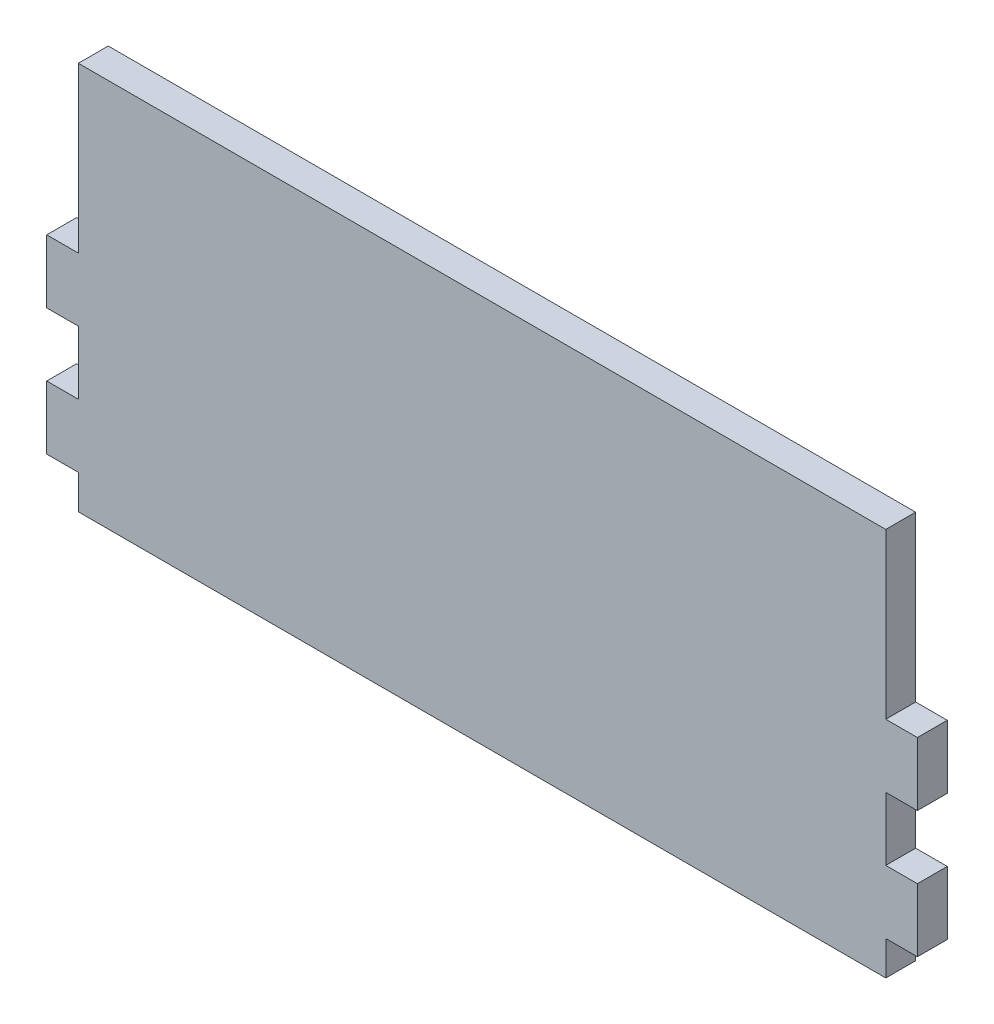
ISO-10303-21;
HEADER;
FILE_DESCRIPTION(('STEP AP214'),'2;1');
FILE_NAME('part.step','',(''),(''),'','','');
FILE_SCHEMA(('AUTOMOTIVE_DESIGN { 1 0 10303 214 1 1 1 1 }'));
ENDSEC;
DATA;
#1=APPLICATION_CONTEXT('core data for automotive mechanical design processes');
#2=APPLICATION_PROTOCOL_DEFINITION('international standard','automotive_design',2000,#1);
#3=PRODUCT_CONTEXT('',#1,'mechanical');
#4=PRODUCT('Part','Part','',(#3));
#5=PRODUCT_RELATED_PRODUCT_CATEGORY('part','',(#4));
#6=PRODUCT_DEFINITION_FORMATION('','',#4);
#7=PRODUCT_DEFINITION_CONTEXT('part definition',#1,'design');
#8=PRODUCT_DEFINITION('design','',#6,#7);
#9=PRODUCT_DEFINITION_SHAPE('','',#8);
#10=(LENGTH_UNIT() NAMED_UNIT(*) SI_UNIT(.MILLI.,.METRE.));
#11=(NAMED_UNIT(*) PLANE_ANGLE_UNIT() SI_UNIT($,.RADIAN.));
#12=(NAMED_UNIT(*) SI_UNIT($,.STERADIAN.) SOLID_ANGLE_UNIT());
#13=UNCERTAINTY_MEASURE_WITH_UNIT(LENGTH_MEASURE(1.E-05),#10,'distance_accuracy_value','');
#14=(GEOMETRIC_REPRESENTATION_CONTEXT(3) GLOBAL_UNCERTAINTY_ASSIGNED_CONTEXT((#13)) GLOBAL_UNIT_ASSIGNED_CONTEXT((#10,
#11,#12)) REPRESENTATION_CONTEXT('',''));
#15=CARTESIAN_POINT('',(0.,0.,0.));
#16=DIRECTION('',(0.,0.,1.));
#17=DIRECTION('',(1.,0.,0.));
#18=AXIS2_PLACEMENT_3D('',#15,#16,#17);
#19=CARTESIAN_POINT('',(81.,0.,2.9972));
#20=DIRECTION('',(0.,1.,0.));
#21=DIRECTION('',(0.,0.,1.));
#22=AXIS2_PLACEMENT_3D('',#19,#20,#21);
#23=PLANE('',#22);
#24=DIRECTION('',(1.,0.,0.));
#25=VECTOR('',#24,1.);
#26=CARTESIAN_POINT('',(81.,0.,0.));
#27=LINE('',#26,#25);
#28=CARTESIAN_POINT('',(0.,0.,0.));
#29=VERTEX_POINT('',#28);
#30=CARTESIAN_POINT('',(81.,0.,0.));
#31=VERTEX_POINT('',#30);
#32=EDGE_CURVE('E201',#29,#31,#27,.T.);
#33=ORIENTED_EDGE('',*,*,#32,.T.);
#34=DIRECTION('',(0.,0.,-1.));
#35=VECTOR('',#34,1.);
#36=CARTESIAN_POINT('',(81.,0.,2.9972));
#37=LINE('',#36,#35);
#38=CARTESIAN_POINT('',(81.,0.,2.9972));
#39=VERTEX_POINT('',#38);
#40=EDGE_CURVE('E11',#39,#31,#37,.T.);
#41=ORIENTED_EDGE('',*,*,#40,.F.);
#42=DIRECTION('',(1.,0.,0.));
#43=VECTOR('',#42,1.);
#44=CARTESIAN_POINT('',(81.,0.,2.9972));
#45=LINE('',#44,#43);
#46=CARTESIAN_POINT('',(0.,0.,2.9972));
#47=VERTEX_POINT('',#46);
#48=EDGE_CURVE('E239',#47,#39,#45,.T.);
#49=ORIENTED_EDGE('',*,*,#48,.F.);
#50=DIRECTION('',(0.,0.,-1.));
#51=VECTOR('',#50,1.);
#52=CARTESIAN_POINT('',(0.,0.,2.9972));
#53=LINE('',#52,#51);
#54=EDGE_CURVE('E197',#47,#29,#53,.T.);
#55=ORIENTED_EDGE('',*,*,#54,.T.);
#56=EDGE_LOOP('',(#33,#41,#49,#55));
#57=FACE_BOUND('',#56,.T.);
#58=ADVANCED_FACE('F33',(#57),#23,.F.);
#59=CARTESIAN_POINT('',(81.,0.,2.9972));
#60=DIRECTION('',(-1.,0.,0.));
#61=DIRECTION('',(0.,0.,1.));
#62=AXIS2_PLACEMENT_3D('',#59,#60,#61);
#63=PLANE('',#62);
#64=DIRECTION('',(0.,1.,0.));
#65=VECTOR('',#64,1.);
#66=CARTESIAN_POINT('',(81.,0.,0.));
#67=LINE('',#66,#65);
#68=CARTESIAN_POINT('',(81.,3.431921508,0.));
#69=VERTEX_POINT('',#68);
#70=EDGE_CURVE('E204',#31,#69,#67,.T.);
#71=ORIENTED_EDGE('',*,*,#70,.T.);
#72=DIRECTION('',(0.,0.,-1.));
#73=VECTOR('',#72,1.);
#74=CARTESIAN_POINT('',(81.,3.431921508,2.9972));
#75=LINE('',#74,#73);
#76=CARTESIAN_POINT('',(81.,3.431921508,2.9972));
#77=VERTEX_POINT('',#76);
#78=EDGE_CURVE('E41',#77,#69,#75,.T.);
#79=ORIENTED_EDGE('',*,*,#78,.F.);
#80=DIRECTION('',(0.,1.,0.));
#81=VECTOR('',#80,1.);
#82=CARTESIAN_POINT('',(81.,0.,2.9972));
#83=LINE('',#82,#81);
#84=EDGE_CURVE('E128',#39,#77,#83,.T.);
#85=ORIENTED_EDGE('',*,*,#84,.F.);
#86=ORIENTED_EDGE('',*,*,#40,.T.);
#87=EDGE_LOOP('',(#71,#79,#85,#86));
#88=FACE_BOUND('',#87,.T.);
#89=ADVANCED_FACE('F357',(#88),#63,.F.);
#90=CARTESIAN_POINT('',(81.,3.431921508,2.9972));
#91=DIRECTION('',(0.,1.,0.));
#92=DIRECTION('',(0.,0.,1.));
#93=AXIS2_PLACEMENT_3D('',#90,#91,#92);
#94=PLANE('',#93);
#95=DIRECTION('',(1.,0.,0.));
#96=VECTOR('',#95,1.);
#97=CARTESIAN_POINT('',(81.,3.431921508,0.));
#98=LINE('',#97,#96);
#99=CARTESIAN_POINT('',(84.175,3.431921508,0.));
#100=VERTEX_POINT('',#99);
#101=EDGE_CURVE('E206',#69,#100,#98,.T.);
#102=ORIENTED_EDGE('',*,*,#101,.T.);
#103=DIRECTION('',(0.,0.,-1.));
#104=VECTOR('',#103,1.);
#105=CARTESIAN_POINT('',(84.175,3.431921508,2.9972));
#106=LINE('',#105,#104);
#107=CARTESIAN_POINT('',(84.175,3.431921508,2.9972));
#108=VERTEX_POINT('',#107);
#109=EDGE_CURVE('E282',#108,#100,#106,.T.);
#110=ORIENTED_EDGE('',*,*,#109,.F.);
#111=DIRECTION('',(1.,0.,0.));
#112=VECTOR('',#111,1.);
#113=CARTESIAN_POINT('',(81.,3.431921508,2.9972));
#114=LINE('',#113,#112);
#115=EDGE_CURVE('E290',#77,#108,#114,.T.);
#116=ORIENTED_EDGE('',*,*,#115,.F.);
#117=ORIENTED_EDGE('',*,*,#78,.T.);
#118=EDGE_LOOP('',(#102,#110,#116,#117));
#119=FACE_BOUND('',#118,.T.);
#120=ADVANCED_FACE('F288',(#119),#94,.F.);
#121=CARTESIAN_POINT('',(84.175,3.431921508,2.9972));
#122=DIRECTION('',(-1.,0.,0.));
#123=DIRECTION('',(0.,0.,1.));
#124=AXIS2_PLACEMENT_3D('',#121,#122,#123);
#125=PLANE('',#124);
#126=DIRECTION('',(0.,1.,0.));
#127=VECTOR('',#126,1.);
#128=CARTESIAN_POINT('',(84.175,3.431921508,0.));
#129=LINE('',#128,#127);
#130=CARTESIAN_POINT('',(84.175,9.781921508,0.));
#131=VERTEX_POINT('',#130);
#132=EDGE_CURVE('E208',#100,#131,#129,.T.);
#133=ORIENTED_EDGE('',*,*,#132,.T.);
#134=DIRECTION('',(0.,0.,-1.));
#135=VECTOR('',#134,1.);
#136=CARTESIAN_POINT('',(84.175,9.781921508,2.9972));
#137=LINE('',#136,#135);
#138=CARTESIAN_POINT('',(84.175,9.781921508,2.9972));
#139=VERTEX_POINT('',#138);
#140=EDGE_CURVE('E279',#139,#131,#137,.T.);
#141=ORIENTED_EDGE('',*,*,#140,.F.);
#142=DIRECTION('',(0.,1.,0.));
#143=VECTOR('',#142,1.);
#144=CARTESIAN_POINT('',(84.175,3.431921508,2.9972));
#145=LINE('',#144,#143);
#146=EDGE_CURVE('E308',#108,#139,#145,.T.);
#147=ORIENTED_EDGE('',*,*,#146,.F.);
#148=ORIENTED_EDGE('',*,*,#109,.T.);
#149=EDGE_LOOP('',(#133,#141,#147,#148));
#150=FACE_BOUND('',#149,.T.);
#151=ADVANCED_FACE('F299',(#150),#125,.F.);
#152=CARTESIAN_POINT('',(84.175,9.781921508,2.9972));
#153=DIRECTION('',(0.,-1.,0.));
#154=DIRECTION('',(0.,0.,-1.));
#155=AXIS2_PLACEMENT_3D('',#152,#153,#154);
#156=PLANE('',#155);
#157=DIRECTION('',(-1.,0.,0.));
#158=VECTOR('',#157,1.);
#159=CARTESIAN_POINT('',(84.175,9.781921508,0.));
#160=LINE('',#159,#158);
#161=CARTESIAN_POINT('',(81.,9.781921508,0.));
#162=VERTEX_POINT('',#161);
#163=EDGE_CURVE('E210',#131,#162,#160,.T.);
#164=ORIENTED_EDGE('',*,*,#163,.T.);
#165=DIRECTION('',(0.,0.,-1.));
#166=VECTOR('',#165,1.);
#167=CARTESIAN_POINT('',(81.,9.781921508,2.9972));
#168=LINE('',#167,#166);
#169=CARTESIAN_POINT('',(81.,9.781921508,2.9972));
#170=VERTEX_POINT('',#169);
#171=EDGE_CURVE('E276',#170,#162,#168,.T.);
#172=ORIENTED_EDGE('',*,*,#171,.F.);
#173=DIRECTION('',(-1.,0.,0.));
#174=VECTOR('',#173,1.);
#175=CARTESIAN_POINT('',(84.175,9.781921508,2.9972));
#176=LINE('',#175,#174);
#177=EDGE_CURVE('E305',#139,#170,#176,.T.);
#178=ORIENTED_EDGE('',*,*,#177,.F.);
#179=ORIENTED_EDGE('',*,*,#140,.T.);
#180=EDGE_LOOP('',(#164,#172,#178,#179));
#181=FACE_BOUND('',#180,.T.);
#182=ADVANCED_FACE('F303',(#181),#156,.F.);
#183=CARTESIAN_POINT('',(81.,9.781921508,2.9972));
#184=DIRECTION('',(-1.,0.,0.));
#185=DIRECTION('',(0.,0.,1.));
#186=AXIS2_PLACEMENT_3D('',#183,#184,#185);
#187=PLANE('',#186);
#188=DIRECTION('',(0.,1.,0.));
#189=VECTOR('',#188,1.);
#190=CARTESIAN_POINT('',(81.,9.781921508,0.));
#191=LINE('',#190,#189);
#192=CARTESIAN_POINT('',(81.,16.131921508,0.));
#193=VERTEX_POINT('',#192);
#194=EDGE_CURVE('E212',#162,#193,#191,.T.);
#195=ORIENTED_EDGE('',*,*,#194,.T.);
#196=DIRECTION('',(0.,0.,-1.));
#197=VECTOR('',#196,1.);
#198=CARTESIAN_POINT('',(81.,16.131921508,2.9972));
#199=LINE('',#198,#197);
#200=CARTESIAN_POINT('',(81.,16.131921508,2.9972));
#201=VERTEX_POINT('',#200);
#202=EDGE_CURVE('E273',#201,#193,#199,.T.);
#203=ORIENTED_EDGE('',*,*,#202,.F.);
#204=DIRECTION('',(0.,1.,0.));
#205=VECTOR('',#204,1.);
#206=CARTESIAN_POINT('',(81.,9.781921508,2.9972));
#207=LINE('',#206,#205);
#208=EDGE_CURVE('E307',#170,#201,#207,.T.);
#209=ORIENTED_EDGE('',*,*,#208,.F.);
#210=ORIENTED_EDGE('',*,*,#171,.T.);
#211=EDGE_LOOP('',(#195,#203,#209,#210));
#212=FACE_BOUND('',#211,.T.);
#213=ADVANCED_FACE('F370',(#212),#187,.F.);
#214=CARTESIAN_POINT('',(81.,16.131921508,2.9972));
#215=DIRECTION('',(0.,1.,0.));
#216=DIRECTION('',(0.,0.,1.));
#217=AXIS2_PLACEMENT_3D('',#214,#215,#216);
#218=PLANE('',#217);
#219=DIRECTION('',(1.,0.,0.));
#220=VECTOR('',#219,1.);
#221=CARTESIAN_POINT('',(81.,16.131921508,0.));
#222=LINE('',#221,#220);
#223=CARTESIAN_POINT('',(84.175,16.131921508,0.));
#224=VERTEX_POINT('',#223);
#225=EDGE_CURVE('E214',#193,#224,#222,.T.);
#226=ORIENTED_EDGE('',*,*,#225,.T.);
#227=DIRECTION('',(0.,0.,-1.));
#228=VECTOR('',#227,1.);
#229=CARTESIAN_POINT('',(84.175,16.131921508,2.9972));
#230=LINE('',#229,#228);
#231=CARTESIAN_POINT('',(84.175,16.131921508,2.9972));
#232=VERTEX_POINT('',#231);
#233=EDGE_CURVE('E270',#232,#224,#230,.T.);
#234=ORIENTED_EDGE('',*,*,#233,.F.);
#235=DIRECTION('',(1.,0.,0.));
#236=VECTOR('',#235,1.);
#237=CARTESIAN_POINT('',(81.,16.131921508,2.9972));
#238=LINE('',#237,#236);
#239=EDGE_CURVE('E310',#201,#232,#238,.T.);
#240=ORIENTED_EDGE('',*,*,#239,.F.);
#241=ORIENTED_EDGE('',*,*,#202,.T.);
#242=EDGE_LOOP('',(#226,#234,#240,#241));
#243=FACE_BOUND('',#242,.T.);
#244=ADVANCED_FACE('F373',(#243),#218,.F.);
#245=CARTESIAN_POINT('',(84.175,16.131921508,2.9972));
#246=DIRECTION('',(-1.,0.,0.));
#247=DIRECTION('',(0.,0.,1.));
#248=AXIS2_PLACEMENT_3D('',#245,#246,#247);
#249=PLANE('',#248);
#250=DIRECTION('',(0.,1.,0.));
#251=VECTOR('',#250,1.);
#252=CARTESIAN_POINT('',(84.175,16.131921508,0.));
#253=LINE('',#252,#251);
#254=CARTESIAN_POINT('',(84.175,22.481921508,0.));
#255=VERTEX_POINT('',#254);
#256=EDGE_CURVE('E216',#224,#255,#253,.T.);
#257=ORIENTED_EDGE('',*,*,#256,.T.);
#258=DIRECTION('',(0.,0.,-1.));
#259=VECTOR('',#258,1.);
#260=CARTESIAN_POINT('',(84.175,22.481921508,2.9972));
#261=LINE('',#260,#259);
#262=CARTESIAN_POINT('',(84.175,22.481921508,2.9972));
#263=VERTEX_POINT('',#262);
#264=EDGE_CURVE('E267',#263,#255,#261,.T.);
#265=ORIENTED_EDGE('',*,*,#264,.F.);
#266=DIRECTION('',(0.,1.,0.));
#267=VECTOR('',#266,1.);
#268=CARTESIAN_POINT('',(84.175,16.131921508,2.9972));
#269=LINE('',#268,#267);
#270=EDGE_CURVE('E316',#232,#263,#269,.T.);
#271=ORIENTED_EDGE('',*,*,#270,.F.);
#272=ORIENTED_EDGE('',*,*,#233,.T.);
#273=EDGE_LOOP('',(#257,#265,#271,#272));
#274=FACE_BOUND('',#273,.T.);
#275=ADVANCED_FACE('F377',(#274),#249,.F.);
#276=CARTESIAN_POINT('',(84.175,22.481921508,2.9972));
#277=DIRECTION('',(0.,-1.,0.));
#278=DIRECTION('',(0.,0.,-1.));
#279=AXIS2_PLACEMENT_3D('',#276,#277,#278);
#280=PLANE('',#279);
#281=DIRECTION('',(-1.,0.,0.));
#282=VECTOR('',#281,1.);
#283=CARTESIAN_POINT('',(84.175,22.481921508,0.));
#284=LINE('',#283,#282);
#285=CARTESIAN_POINT('',(81.,22.481921508,0.));
#286=VERTEX_POINT('',#285);
#287=EDGE_CURVE('E218',#255,#286,#284,.T.);
#288=ORIENTED_EDGE('',*,*,#287,.T.);
#289=DIRECTION('',(0.,0.,-1.));
#290=VECTOR('',#289,1.);
#291=CARTESIAN_POINT('',(81.,22.481921508,2.9972));
#292=LINE('',#291,#290);
#293=CARTESIAN_POINT('',(81.,22.481921508,2.9972));
#294=VERTEX_POINT('',#293);
#295=EDGE_CURVE('E264',#294,#286,#292,.T.);
#296=ORIENTED_EDGE('',*,*,#295,.F.);
#297=DIRECTION('',(-1.,0.,0.));
#298=VECTOR('',#297,1.);
#299=CARTESIAN_POINT('',(84.175,22.481921508,2.9972));
#300=LINE('',#299,#298);
#301=EDGE_CURVE('E318',#263,#294,#300,.T.);
#302=ORIENTED_EDGE('',*,*,#301,.F.);
#303=ORIENTED_EDGE('',*,*,#264,.T.);
#304=EDGE_LOOP('',(#288,#296,#302,#303));
#305=FACE_BOUND('',#304,.T.);
#306=ADVANCED_FACE('F381',(#305),#280,.F.);
#307=CARTESIAN_POINT('',(81.,22.481921508,2.9972));
#308=DIRECTION('',(-1.,0.,0.));
#309=DIRECTION('',(0.,0.,1.));
#310=AXIS2_PLACEMENT_3D('',#307,#308,#309);
#311=PLANE('',#310);
#312=DIRECTION('',(0.,1.,0.));
#313=VECTOR('',#312,1.);
#314=CARTESIAN_POINT('',(81.,22.481921508,0.));
#315=LINE('',#314,#313);
#316=CARTESIAN_POINT('',(81.,38.975223802,0.));
#317=VERTEX_POINT('',#316);
#318=EDGE_CURVE('E220',#286,#317,#315,.T.);
#319=ORIENTED_EDGE('',*,*,#318,.T.);
#320=DIRECTION('',(0.,0.,-1.));
#321=VECTOR('',#320,1.);
#322=CARTESIAN_POINT('',(81.,38.975223802,2.9972));
#323=LINE('',#322,#321);
#324=CARTESIAN_POINT('',(81.,38.975223802,2.9972));
#325=VERTEX_POINT('',#324);
#326=EDGE_CURVE('E261',#325,#317,#323,.T.);
#327=ORIENTED_EDGE('',*,*,#326,.F.);
#328=DIRECTION('',(0.,1.,0.));
#329=VECTOR('',#328,1.);
#330=CARTESIAN_POINT('',(81.,22.481921508,2.9972));
#331=LINE('',#330,#329);
#332=EDGE_CURVE('E320',#294,#325,#331,.T.);
#333=ORIENTED_EDGE('',*,*,#332,.F.);
#334=ORIENTED_EDGE('',*,*,#295,.T.);
#335=EDGE_LOOP('',(#319,#327,#333,#334));
#336=FACE_BOUND('',#335,.T.);
#337=ADVANCED_FACE('F385',(#336),#311,.F.);
#338=CARTESIAN_POINT('',(0.,38.975223802,2.9972));
#339=DIRECTION('',(0.,-1.,0.));
#340=DIRECTION('',(0.,0.,-1.));
#341=AXIS2_PLACEMENT_3D('',#338,#339,#340);
#342=PLANE('',#341);
#343=DIRECTION('',(-1.,0.,0.));
#344=VECTOR('',#343,1.);
#345=CARTESIAN_POINT('',(0.,38.975223802,0.));
#346=LINE('',#345,#344);
#347=CARTESIAN_POINT('',(0.,38.975223802,0.));
#348=VERTEX_POINT('',#347);
#349=EDGE_CURVE('E222',#317,#348,#346,.T.);
#350=ORIENTED_EDGE('',*,*,#349,.T.);
#351=DIRECTION('',(0.,0.,-1.));
#352=VECTOR('',#351,1.);
#353=CARTESIAN_POINT('',(0.,38.975223802,2.9972));
#354=LINE('',#353,#352);
#355=CARTESIAN_POINT('',(0.,38.975223802,2.9972));
#356=VERTEX_POINT('',#355);
#357=EDGE_CURVE('E258',#356,#348,#354,.T.);
#358=ORIENTED_EDGE('',*,*,#357,.F.);
#359=DIRECTION('',(-1.,0.,0.));
#360=VECTOR('',#359,1.);
#361=CARTESIAN_POINT('',(0.,38.975223802,2.9972));
#362=LINE('',#361,#360);
#363=EDGE_CURVE('E322',#325,#356,#362,.T.);
#364=ORIENTED_EDGE('',*,*,#363,.F.);
#365=ORIENTED_EDGE('',*,*,#326,.T.);
#366=EDGE_LOOP('',(#350,#358,#364,#365));
#367=FACE_BOUND('',#366,.T.);
#368=ADVANCED_FACE('F389',(#367),#342,.F.);
#369=CARTESIAN_POINT('',(0.,22.481921508,2.9972));
#370=DIRECTION('',(1.,0.,0.));
#371=DIRECTION('',(0.,0.,-1.));
#372=AXIS2_PLACEMENT_3D('',#369,#370,#371);
#373=PLANE('',#372);
#374=DIRECTION('',(0.,-1.,0.));
#375=VECTOR('',#374,1.);
#376=CARTESIAN_POINT('',(0.,22.481921508,0.));
#377=LINE('',#376,#375);
#378=CARTESIAN_POINT('',(0.,22.481921508,0.));
#379=VERTEX_POINT('',#378);
#380=EDGE_CURVE('E224',#348,#379,#377,.T.);
#381=ORIENTED_EDGE('',*,*,#380,.T.);
#382=DIRECTION('',(0.,0.,-1.));
#383=VECTOR('',#382,1.);
#384=CARTESIAN_POINT('',(0.,22.481921508,2.9972));
#385=LINE('',#384,#383);
#386=CARTESIAN_POINT('',(0.,22.481921508,2.9972));
#387=VERTEX_POINT('',#386);
#388=EDGE_CURVE('E255',#387,#379,#385,.T.);
#389=ORIENTED_EDGE('',*,*,#388,.F.);
#390=DIRECTION('',(0.,-1.,0.));
#391=VECTOR('',#390,1.);
#392=CARTESIAN_POINT('',(0.,22.481921508,2.9972));
#393=LINE('',#392,#391);
#394=EDGE_CURVE('E324',#356,#387,#393,.T.);
#395=ORIENTED_EDGE('',*,*,#394,.F.);
#396=ORIENTED_EDGE('',*,*,#357,.T.);
#397=EDGE_LOOP('',(#381,#389,#395,#396));
#398=FACE_BOUND('',#397,.T.);
#399=ADVANCED_FACE('F393',(#398),#373,.F.);
#400=CARTESIAN_POINT('',(-3.175,22.481921508,2.9972));
#401=DIRECTION('',(0.,-1.,0.));
#402=DIRECTION('',(0.,0.,-1.));
#403=AXIS2_PLACEMENT_3D('',#400,#401,#402);
#404=PLANE('',#403);
#405=DIRECTION('',(-1.,0.,0.));
#406=VECTOR('',#405,1.);
#407=CARTESIAN_POINT('',(-3.175,22.481921508,0.));
#408=LINE('',#407,#406);
#409=CARTESIAN_POINT('',(-3.175,22.481921508,0.));
#410=VERTEX_POINT('',#409);
#411=EDGE_CURVE('E226',#379,#410,#408,.T.);
#412=ORIENTED_EDGE('',*,*,#411,.T.);
#413=DIRECTION('',(0.,0.,-1.));
#414=VECTOR('',#413,1.);
#415=CARTESIAN_POINT('',(-3.175,22.481921508,2.9972));
#416=LINE('',#415,#414);
#417=CARTESIAN_POINT('',(-3.175,22.481921508,2.9972));
#418=VERTEX_POINT('',#417);
#419=EDGE_CURVE('E252',#418,#410,#416,.T.);
#420=ORIENTED_EDGE('',*,*,#419,.F.);
#421=DIRECTION('',(-1.,0.,0.));
#422=VECTOR('',#421,1.);
#423=CARTESIAN_POINT('',(-3.175,22.481921508,2.9972));
#424=LINE('',#423,#422);
#425=EDGE_CURVE('E326',#387,#418,#424,.T.);
#426=ORIENTED_EDGE('',*,*,#425,.F.);
#427=ORIENTED_EDGE('',*,*,#388,.T.);
#428=EDGE_LOOP('',(#412,#420,#426,#427));
#429=FACE_BOUND('',#428,.T.);
#430=ADVANCED_FACE('F397',(#429),#404,.F.);
#431=CARTESIAN_POINT('',(-3.175,16.131921508,2.9972));
#432=DIRECTION('',(1.,0.,0.));
#433=DIRECTION('',(0.,0.,-1.));
#434=AXIS2_PLACEMENT_3D('',#431,#432,#433);
#435=PLANE('',#434);
#436=DIRECTION('',(0.,-1.,0.));
#437=VECTOR('',#436,1.);
#438=CARTESIAN_POINT('',(-3.175,16.131921508,0.));
#439=LINE('',#438,#437);
#440=CARTESIAN_POINT('',(-3.175,16.131921508,0.));
#441=VERTEX_POINT('',#440);
#442=EDGE_CURVE('E228',#410,#441,#439,.T.);
#443=ORIENTED_EDGE('',*,*,#442,.T.);
#444=DIRECTION('',(0.,0.,-1.));
#445=VECTOR('',#444,1.);
#446=CARTESIAN_POINT('',(-3.175,16.131921508,2.9972));
#447=LINE('',#446,#445);
#448=CARTESIAN_POINT('',(-3.175,16.131921508,2.9972));
#449=VERTEX_POINT('',#448);
#450=EDGE_CURVE('E249',#449,#441,#447,.T.);
#451=ORIENTED_EDGE('',*,*,#450,.F.);
#452=DIRECTION('',(0.,-1.,0.));
#453=VECTOR('',#452,1.);
#454=CARTESIAN_POINT('',(-3.175,16.131921508,2.9972));
#455=LINE('',#454,#453);
#456=EDGE_CURVE('E328',#418,#449,#455,.T.);
#457=ORIENTED_EDGE('',*,*,#456,.F.);
#458=ORIENTED_EDGE('',*,*,#419,.T.);
#459=EDGE_LOOP('',(#443,#451,#457,#458));
#460=FACE_BOUND('',#459,.T.);
#461=ADVANCED_FACE('F401',(#460),#435,.F.);
#462=CARTESIAN_POINT('',(0.,16.131921508,2.9972));
#463=DIRECTION('',(0.,1.,0.));
#464=DIRECTION('',(0.,0.,1.));
#465=AXIS2_PLACEMENT_3D('',#462,#463,#464);
#466=PLANE('',#465);
#467=DIRECTION('',(1.,0.,0.));
#468=VECTOR('',#467,1.);
#469=CARTESIAN_POINT('',(0.,16.131921508,0.));
#470=LINE('',#469,#468);
#471=CARTESIAN_POINT('',(0.,16.131921508,0.));
#472=VERTEX_POINT('',#471);
#473=EDGE_CURVE('E230',#441,#472,#470,.T.);
#474=ORIENTED_EDGE('',*,*,#473,.T.);
#475=DIRECTION('',(0.,0.,-1.));
#476=VECTOR('',#475,1.);
#477=CARTESIAN_POINT('',(0.,16.131921508,2.9972));
#478=LINE('',#477,#476);
#479=CARTESIAN_POINT('',(0.,16.131921508,2.9972));
#480=VERTEX_POINT('',#479);
#481=EDGE_CURVE('E246',#480,#472,#478,.T.);
#482=ORIENTED_EDGE('',*,*,#481,.F.);
#483=DIRECTION('',(1.,0.,0.));
#484=VECTOR('',#483,1.);
#485=CARTESIAN_POINT('',(0.,16.131921508,2.9972));
#486=LINE('',#485,#484);
#487=EDGE_CURVE('E330',#449,#480,#486,.T.);
#488=ORIENTED_EDGE('',*,*,#487,.F.);
#489=ORIENTED_EDGE('',*,*,#450,.T.);
#490=EDGE_LOOP('',(#474,#482,#488,#489));
#491=FACE_BOUND('',#490,.T.);
#492=ADVANCED_FACE('F405',(#491),#466,.F.);
#493=CARTESIAN_POINT('',(0.,9.781921508,2.9972));
#494=DIRECTION('',(1.,0.,0.));
#495=DIRECTION('',(0.,0.,-1.));
#496=AXIS2_PLACEMENT_3D('',#493,#494,#495);
#497=PLANE('',#496);
#498=DIRECTION('',(0.,-1.,0.));
#499=VECTOR('',#498,1.);
#500=CARTESIAN_POINT('',(0.,9.781921508,0.));
#501=LINE('',#500,#499);
#502=CARTESIAN_POINT('',(0.,9.781921508,0.));
#503=VERTEX_POINT('',#502);
#504=EDGE_CURVE('E232',#472,#503,#501,.T.);
#505=ORIENTED_EDGE('',*,*,#504,.T.);
#506=DIRECTION('',(0.,0.,-1.));
#507=VECTOR('',#506,1.);
#508=CARTESIAN_POINT('',(0.,9.781921508,2.9972));
#509=LINE('',#508,#507);
#510=CARTESIAN_POINT('',(0.,9.781921508,2.9972));
#511=VERTEX_POINT('',#510);
#512=EDGE_CURVE('E243',#511,#503,#509,.T.);
#513=ORIENTED_EDGE('',*,*,#512,.F.);
#514=DIRECTION('',(0.,-1.,0.));
#515=VECTOR('',#514,1.);
#516=CARTESIAN_POINT('',(0.,9.781921508,2.9972));
#517=LINE('',#516,#515);
#518=EDGE_CURVE('E332',#480,#511,#517,.T.);
#519=ORIENTED_EDGE('',*,*,#518,.F.);
#520=ORIENTED_EDGE('',*,*,#481,.T.);
#521=EDGE_LOOP('',(#505,#513,#519,#520));
#522=FACE_BOUND('',#521,.T.);
#523=ADVANCED_FACE('F338',(#522),#497,.F.);
#524=CARTESIAN_POINT('',(-3.175,9.781921508,2.9972));
#525=DIRECTION('',(0.,-1.,0.));
#526=DIRECTION('',(0.,0.,-1.));
#527=AXIS2_PLACEMENT_3D('',#524,#525,#526);
#528=PLANE('',#527);
#529=DIRECTION('',(-1.,0.,0.));
#530=VECTOR('',#529,1.);
#531=CARTESIAN_POINT('',(-3.175,9.781921508,0.));
#532=LINE('',#531,#530);
#533=CARTESIAN_POINT('',(-3.175,9.781921508,0.));
#534=VERTEX_POINT('',#533);
#535=EDGE_CURVE('E234',#503,#534,#532,.T.);
#536=ORIENTED_EDGE('',*,*,#535,.T.);
#537=DIRECTION('',(0.,0.,-1.));
#538=VECTOR('',#537,1.);
#539=CARTESIAN_POINT('',(-3.175,9.781921508,2.9972));
#540=LINE('',#539,#538);
#541=CARTESIAN_POINT('',(-3.175,9.781921508,2.9972));
#542=VERTEX_POINT('',#541);
#543=EDGE_CURVE('E192',#542,#534,#540,.T.);
#544=ORIENTED_EDGE('',*,*,#543,.F.);
#545=DIRECTION('',(-1.,0.,0.));
#546=VECTOR('',#545,1.);
#547=CARTESIAN_POINT('',(-3.175,9.781921508,2.9972));
#548=LINE('',#547,#546);
#549=EDGE_CURVE('E183',#511,#542,#548,.T.);
#550=ORIENTED_EDGE('',*,*,#549,.F.);
#551=ORIENTED_EDGE('',*,*,#512,.T.);
#552=EDGE_LOOP('',(#536,#544,#550,#551));
#553=FACE_BOUND('',#552,.T.);
#554=ADVANCED_FACE('F342',(#553),#528,.F.);
#555=CARTESIAN_POINT('',(-3.175,3.431921508,2.9972));
#556=DIRECTION('',(1.,0.,0.));
#557=DIRECTION('',(0.,1.,0.));
#558=AXIS2_PLACEMENT_3D('',#555,#556,#557);
#559=PLANE('',#558);
#560=DIRECTION('',(0.,-1.,0.));
#561=VECTOR('',#560,1.);
#562=CARTESIAN_POINT('',(-3.175,3.431921508,0.));
#563=LINE('',#562,#561);
#564=CARTESIAN_POINT('',(-3.175,3.431921508,0.));
#565=VERTEX_POINT('',#564);
#566=EDGE_CURVE('E191',#534,#565,#563,.T.);
#567=ORIENTED_EDGE('',*,*,#566,.T.);
#568=DIRECTION('',(0.,0.,-1.));
#569=VECTOR('',#568,1.);
#570=CARTESIAN_POINT('',(-3.175,3.431921508,2.9972));
#571=LINE('',#570,#569);
#572=CARTESIAN_POINT('',(-3.175,3.431921508,2.9972));
#573=VERTEX_POINT('',#572);
#574=EDGE_CURVE('E188',#573,#565,#571,.T.);
#575=ORIENTED_EDGE('',*,*,#574,.F.);
#576=DIRECTION('',(0.,-1.,0.));
#577=VECTOR('',#576,1.);
#578=CARTESIAN_POINT('',(-3.175,3.431921508,2.9972));
#579=LINE('',#578,#577);
#580=EDGE_CURVE('E177',#542,#573,#579,.T.);
#581=ORIENTED_EDGE('',*,*,#580,.F.);
#582=ORIENTED_EDGE('',*,*,#543,.T.);
#583=EDGE_LOOP('',(#567,#575,#581,#582));
#584=FACE_BOUND('',#583,.T.);
#585=ADVANCED_FACE('F189',(#584),#559,.F.);
#586=CARTESIAN_POINT('',(0.,3.431921508,2.9972));
#587=DIRECTION('',(0.,1.,0.));
#588=DIRECTION('',(0.,0.,1.));
#589=AXIS2_PLACEMENT_3D('',#586,#587,#588);
#590=PLANE('',#589);
#591=DIRECTION('',(1.,0.,0.));
#592=VECTOR('',#591,1.);
#593=CARTESIAN_POINT('',(0.,3.431921508,0.));
#594=LINE('',#593,#592);
#595=CARTESIAN_POINT('',(0.,3.431921508,0.));
#596=VERTEX_POINT('',#595);
#597=EDGE_CURVE('E114',#565,#596,#594,.T.);
#598=ORIENTED_EDGE('',*,*,#597,.T.);
#599=DIRECTION('',(0.,0.,-1.));
#600=VECTOR('',#599,1.);
#601=CARTESIAN_POINT('',(0.,3.431921508,2.9972));
#602=LINE('',#601,#600);
#603=CARTESIAN_POINT('',(0.,3.431921508,2.9972));
#604=VERTEX_POINT('',#603);
#605=EDGE_CURVE('E193',#604,#596,#602,.T.);
#606=ORIENTED_EDGE('',*,*,#605,.F.);
#607=DIRECTION('',(1.,0.,0.));
#608=VECTOR('',#607,1.);
#609=CARTESIAN_POINT('',(0.,3.431921508,2.9972));
#610=LINE('',#609,#608);
#611=EDGE_CURVE('E181',#573,#604,#610,.T.);
#612=ORIENTED_EDGE('',*,*,#611,.F.);
#613=ORIENTED_EDGE('',*,*,#574,.T.);
#614=EDGE_LOOP('',(#598,#606,#612,#613));
#615=FACE_BOUND('',#614,.T.);
#616=ADVANCED_FACE('F195',(#615),#590,.F.);
#617=CARTESIAN_POINT('',(0.,0.,2.9972));
#618=DIRECTION('',(1.,0.,0.));
#619=DIRECTION('',(0.,0.,-1.));
#620=AXIS2_PLACEMENT_3D('',#617,#618,#619);
#621=PLANE('',#620);
#622=DIRECTION('',(0.,-1.,0.));
#623=VECTOR('',#622,1.);
#624=CARTESIAN_POINT('',(0.,0.,0.));
#625=LINE('',#624,#623);
#626=EDGE_CURVE('E120',#596,#29,#625,.T.);
#627=ORIENTED_EDGE('',*,*,#626,.T.);
#628=ORIENTED_EDGE('',*,*,#54,.F.);
#629=DIRECTION('',(0.,-1.,0.));
#630=VECTOR('',#629,1.);
#631=CARTESIAN_POINT('',(0.,0.,2.9972));
#632=LINE('',#631,#630);
#633=EDGE_CURVE('E49',#604,#47,#632,.T.);
#634=ORIENTED_EDGE('',*,*,#633,.F.);
#635=ORIENTED_EDGE('',*,*,#605,.T.);
#636=EDGE_LOOP('',(#627,#628,#634,#635));
#637=FACE_BOUND('',#636,.T.);
#638=ADVANCED_FACE('F346',(#637),#621,.F.);
#639=CARTESIAN_POINT('',(0.,0.,2.9972));
#640=DIRECTION('',(0.,0.,-1.));
#641=DIRECTION('',(-1.,0.,0.));
#642=AXIS2_PLACEMENT_3D('',#639,#640,#641);
#643=PLANE('',#642);
#644=ORIENTED_EDGE('',*,*,#48,.T.);
#645=ORIENTED_EDGE('',*,*,#84,.T.);
#646=ORIENTED_EDGE('',*,*,#115,.T.);
#647=ORIENTED_EDGE('',*,*,#146,.T.);
#648=ORIENTED_EDGE('',*,*,#177,.T.);
#649=ORIENTED_EDGE('',*,*,#208,.T.);
#650=ORIENTED_EDGE('',*,*,#239,.T.);
#651=ORIENTED_EDGE('',*,*,#270,.T.);
#652=ORIENTED_EDGE('',*,*,#301,.T.);
#653=ORIENTED_EDGE('',*,*,#332,.T.);
#654=ORIENTED_EDGE('',*,*,#363,.T.);
#655=ORIENTED_EDGE('',*,*,#394,.T.);
#656=ORIENTED_EDGE('',*,*,#425,.T.);
#657=ORIENTED_EDGE('',*,*,#456,.T.);
#658=ORIENTED_EDGE('',*,*,#487,.T.);
#659=ORIENTED_EDGE('',*,*,#518,.T.);
#660=ORIENTED_EDGE('',*,*,#549,.T.);
#661=ORIENTED_EDGE('',*,*,#580,.T.);
#662=ORIENTED_EDGE('',*,*,#611,.T.);
#663=ORIENTED_EDGE('',*,*,#633,.T.);
#664=EDGE_LOOP('',(#644,#645,#646,#647,#648,#649,#650,#651,#652,#653,#654,#655,#656,#657,#658,
#659,#660,#661,#662,#663));
#665=FACE_BOUND('',#664,.T.);
#666=ADVANCED_FACE('F179',(#665),#643,.F.);
#667=CARTESIAN_POINT('',(0.,0.,0.));
#668=DIRECTION('',(0.,0.,-1.));
#669=DIRECTION('',(-1.,0.,0.));
#670=AXIS2_PLACEMENT_3D('',#667,#668,#669);
#671=PLANE('',#670);
#672=ORIENTED_EDGE('',*,*,#32,.F.);
#673=ORIENTED_EDGE('',*,*,#626,.F.);
#674=ORIENTED_EDGE('',*,*,#597,.F.);
#675=ORIENTED_EDGE('',*,*,#566,.F.);
#676=ORIENTED_EDGE('',*,*,#535,.F.);
#677=ORIENTED_EDGE('',*,*,#504,.F.);
#678=ORIENTED_EDGE('',*,*,#473,.F.);
#679=ORIENTED_EDGE('',*,*,#442,.F.);
#680=ORIENTED_EDGE('',*,*,#411,.F.);
#681=ORIENTED_EDGE('',*,*,#380,.F.);
#682=ORIENTED_EDGE('',*,*,#349,.F.);
#683=ORIENTED_EDGE('',*,*,#318,.F.);
#684=ORIENTED_EDGE('',*,*,#287,.F.);
#685=ORIENTED_EDGE('',*,*,#256,.F.);
#686=ORIENTED_EDGE('',*,*,#225,.F.);
#687=ORIENTED_EDGE('',*,*,#194,.F.);
#688=ORIENTED_EDGE('',*,*,#163,.F.);
#689=ORIENTED_EDGE('',*,*,#132,.F.);
#690=ORIENTED_EDGE('',*,*,#101,.F.);
#691=ORIENTED_EDGE('',*,*,#70,.F.);
#692=EDGE_LOOP('',(#672,#673,#674,#675,#676,#677,#678,#679,#680,#681,#682,#683,#684,#685,#686,
#687,#688,#689,#690,#691));
#693=FACE_BOUND('',#692,.T.);
#694=ADVANCED_FACE('F294',(#693),#671,.T.);
#695=CLOSED_SHELL('',(#58,#89,#120,#151,#182,#213,#244,#275,#306,#337,#368,#399,#430,#461,#492,
#523,#554,#585,#616,#638,#666,#694));
#696=MANIFOLD_SOLID_BREP('B2',#695);
#697=ADVANCED_BREP_SHAPE_REPRESENTATION('',(#18,#696),#14);
#698=SHAPE_DEFINITION_REPRESENTATION(#9,#697);
ENDSEC;
END-ISO-10303-21;
